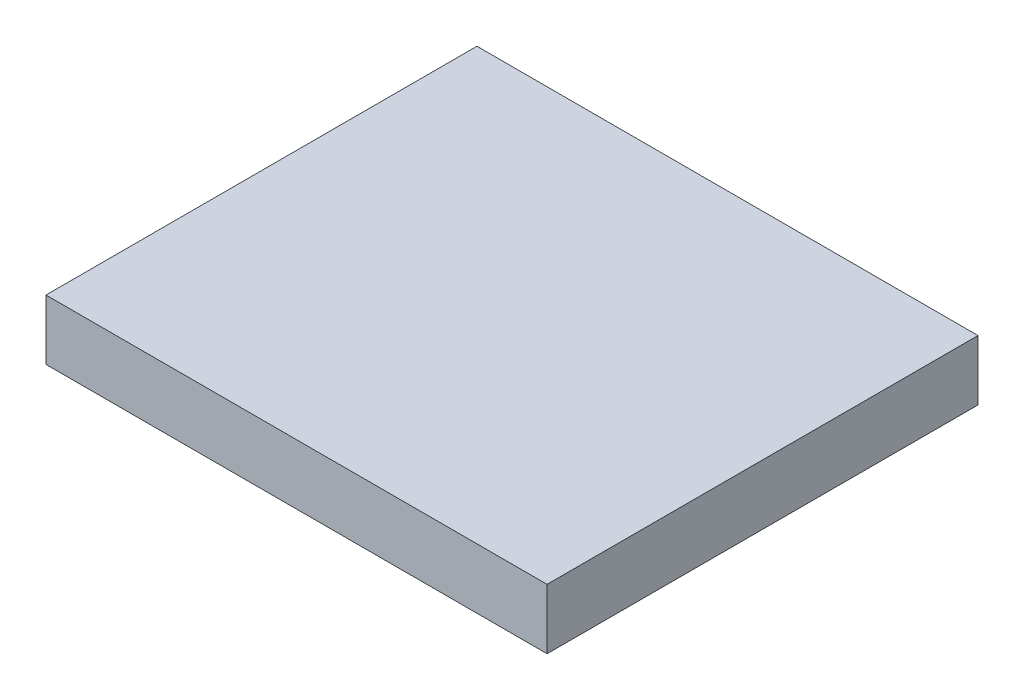
ISO-10303-21;
HEADER;
FILE_DESCRIPTION(('STEP AP214'),'2;1');
FILE_NAME('part.step','',(''),(''),'','','');
FILE_SCHEMA(('AUTOMOTIVE_DESIGN { 1 0 10303 214 1 1 1 1 }'));
ENDSEC;
DATA;
#1=APPLICATION_CONTEXT('core data for automotive mechanical design processes');
#2=APPLICATION_PROTOCOL_DEFINITION('international standard','automotive_design',2000,#1);
#3=PRODUCT_CONTEXT('',#1,'mechanical');
#4=PRODUCT('Part','Part','',(#3));
#5=PRODUCT_RELATED_PRODUCT_CATEGORY('part','',(#4));
#6=PRODUCT_DEFINITION_FORMATION('','',#4);
#7=PRODUCT_DEFINITION_CONTEXT('part definition',#1,'design');
#8=PRODUCT_DEFINITION('design','',#6,#7);
#9=PRODUCT_DEFINITION_SHAPE('','',#8);
#10=(LENGTH_UNIT() NAMED_UNIT(*) SI_UNIT(.MILLI.,.METRE.));
#11=(NAMED_UNIT(*) PLANE_ANGLE_UNIT() SI_UNIT($,.RADIAN.));
#12=(NAMED_UNIT(*) SI_UNIT($,.STERADIAN.) SOLID_ANGLE_UNIT());
#13=UNCERTAINTY_MEASURE_WITH_UNIT(LENGTH_MEASURE(1.E-05),#10,'distance_accuracy_value','');
#14=(GEOMETRIC_REPRESENTATION_CONTEXT(3) GLOBAL_UNCERTAINTY_ASSIGNED_CONTEXT((#13)) GLOBAL_UNIT_ASSIGNED_CONTEXT((#10,
#11,#12)) REPRESENTATION_CONTEXT('',''));
#15=CARTESIAN_POINT('',(0.,0.,0.));
#16=DIRECTION('',(0.,0.,1.));
#17=DIRECTION('',(1.,0.,0.));
#18=AXIS2_PLACEMENT_3D('',#15,#16,#17);
#19=CARTESIAN_POINT('',(25.,6.,-21.5));
#20=DIRECTION('',(-1.,0.,0.));
#21=DIRECTION('',(0.,0.,1.));
#22=AXIS2_PLACEMENT_3D('',#19,#20,#21);
#23=PLANE('',#22);
#24=DIRECTION('',(0.,0.,-1.));
#25=VECTOR('',#24,1.);
#26=CARTESIAN_POINT('',(25.,0.,-21.5));
#27=LINE('',#26,#25);
#28=CARTESIAN_POINT('',(25.,0.,21.5));
#29=VERTEX_POINT('',#28);
#30=CARTESIAN_POINT('',(25.,0.,-21.5));
#31=VERTEX_POINT('',#30);
#32=EDGE_CURVE('E96',#29,#31,#27,.T.);
#33=ORIENTED_EDGE('',*,*,#32,.T.);
#34=DIRECTION('',(0.,-1.,0.));
#35=VECTOR('',#34,1.);
#36=CARTESIAN_POINT('',(25.,6.,-21.5));
#37=LINE('',#36,#35);
#38=CARTESIAN_POINT('',(25.,6.,-21.5));
#39=VERTEX_POINT('',#38);
#40=EDGE_CURVE('E11',#39,#31,#37,.T.);
#41=ORIENTED_EDGE('',*,*,#40,.F.);
#42=DIRECTION('',(0.,0.,-1.));
#43=VECTOR('',#42,1.);
#44=CARTESIAN_POINT('',(25.,6.,-21.5));
#45=LINE('',#44,#43);
#46=CARTESIAN_POINT('',(25.,6.,21.5));
#47=VERTEX_POINT('',#46);
#48=EDGE_CURVE('E84',#47,#39,#45,.T.);
#49=ORIENTED_EDGE('',*,*,#48,.F.);
#50=DIRECTION('',(0.,-1.,0.));
#51=VECTOR('',#50,1.);
#52=CARTESIAN_POINT('',(25.,6.,21.5));
#53=LINE('',#52,#51);
#54=EDGE_CURVE('E92',#47,#29,#53,.T.);
#55=ORIENTED_EDGE('',*,*,#54,.T.);
#56=EDGE_LOOP('',(#33,#41,#49,#55));
#57=FACE_BOUND('',#56,.T.);
#58=ADVANCED_FACE('F33',(#57),#23,.F.);
#59=CARTESIAN_POINT('',(-25.,6.,-21.5));
#60=DIRECTION('',(0.,0.,1.));
#61=DIRECTION('',(1.,0.,0.));
#62=AXIS2_PLACEMENT_3D('',#59,#60,#61);
#63=PLANE('',#62);
#64=DIRECTION('',(-1.,0.,0.));
#65=VECTOR('',#64,1.);
#66=CARTESIAN_POINT('',(-25.,0.,-21.5));
#67=LINE('',#66,#65);
#68=CARTESIAN_POINT('',(-25.,0.,-21.5));
#69=VERTEX_POINT('',#68);
#70=EDGE_CURVE('E88',#31,#69,#67,.T.);
#71=ORIENTED_EDGE('',*,*,#70,.T.);
#72=DIRECTION('',(0.,-1.,0.));
#73=VECTOR('',#72,1.);
#74=CARTESIAN_POINT('',(-25.,6.,-21.5));
#75=LINE('',#74,#73);
#76=CARTESIAN_POINT('',(-25.,6.,-21.5));
#77=VERTEX_POINT('',#76);
#78=EDGE_CURVE('E41',#77,#69,#75,.T.);
#79=ORIENTED_EDGE('',*,*,#78,.F.);
#80=DIRECTION('',(-1.,0.,0.));
#81=VECTOR('',#80,1.);
#82=CARTESIAN_POINT('',(-25.,6.,-21.5));
#83=LINE('',#82,#81);
#84=EDGE_CURVE('E79',#39,#77,#83,.T.);
#85=ORIENTED_EDGE('',*,*,#84,.F.);
#86=ORIENTED_EDGE('',*,*,#40,.T.);
#87=EDGE_LOOP('',(#71,#79,#85,#86));
#88=FACE_BOUND('',#87,.T.);
#89=ADVANCED_FACE('F87',(#88),#63,.F.);
#90=CARTESIAN_POINT('',(-25.,6.,-21.5));
#91=DIRECTION('',(1.,0.,0.));
#92=DIRECTION('',(0.,0.,-1.));
#93=AXIS2_PLACEMENT_3D('',#90,#91,#92);
#94=PLANE('',#93);
#95=DIRECTION('',(0.,0.,1.));
#96=VECTOR('',#95,1.);
#97=CARTESIAN_POINT('',(-25.,0.,-21.5));
#98=LINE('',#97,#96);
#99=CARTESIAN_POINT('',(-25.,0.,21.5));
#100=VERTEX_POINT('',#99);
#101=EDGE_CURVE('E66',#69,#100,#98,.T.);
#102=ORIENTED_EDGE('',*,*,#101,.T.);
#103=DIRECTION('',(0.,-1.,0.));
#104=VECTOR('',#103,1.);
#105=CARTESIAN_POINT('',(-25.,6.,21.5));
#106=LINE('',#105,#104);
#107=CARTESIAN_POINT('',(-25.,6.,21.5));
#108=VERTEX_POINT('',#107);
#109=EDGE_CURVE('E89',#108,#100,#106,.T.);
#110=ORIENTED_EDGE('',*,*,#109,.F.);
#111=DIRECTION('',(0.,0.,1.));
#112=VECTOR('',#111,1.);
#113=CARTESIAN_POINT('',(-25.,6.,-21.5));
#114=LINE('',#113,#112);
#115=EDGE_CURVE('E82',#77,#108,#114,.T.);
#116=ORIENTED_EDGE('',*,*,#115,.F.);
#117=ORIENTED_EDGE('',*,*,#78,.T.);
#118=EDGE_LOOP('',(#102,#110,#116,#117));
#119=FACE_BOUND('',#118,.T.);
#120=ADVANCED_FACE('F90',(#119),#94,.F.);
#121=CARTESIAN_POINT('',(-25.,6.,21.5));
#122=DIRECTION('',(0.,0.,-1.));
#123=DIRECTION('',(-1.,0.,0.));
#124=AXIS2_PLACEMENT_3D('',#121,#122,#123);
#125=PLANE('',#124);
#126=DIRECTION('',(1.,0.,0.));
#127=VECTOR('',#126,1.);
#128=CARTESIAN_POINT('',(-25.,0.,21.5));
#129=LINE('',#128,#127);
#130=EDGE_CURVE('E72',#100,#29,#129,.T.);
#131=ORIENTED_EDGE('',*,*,#130,.T.);
#132=ORIENTED_EDGE('',*,*,#54,.F.);
#133=DIRECTION('',(1.,0.,0.));
#134=VECTOR('',#133,1.);
#135=CARTESIAN_POINT('',(-25.,6.,21.5));
#136=LINE('',#135,#134);
#137=EDGE_CURVE('E49',#108,#47,#136,.T.);
#138=ORIENTED_EDGE('',*,*,#137,.F.);
#139=ORIENTED_EDGE('',*,*,#109,.T.);
#140=EDGE_LOOP('',(#131,#132,#138,#139));
#141=FACE_BOUND('',#140,.T.);
#142=ADVANCED_FACE('F103',(#141),#125,.F.);
#143=CARTESIAN_POINT('',(0.,6.,0.));
#144=DIRECTION('',(0.,1.,0.));
#145=DIRECTION('',(0.,0.,1.));
#146=AXIS2_PLACEMENT_3D('',#143,#144,#145);
#147=PLANE('',#146);
#148=ORIENTED_EDGE('',*,*,#48,.T.);
#149=ORIENTED_EDGE('',*,*,#84,.T.);
#150=ORIENTED_EDGE('',*,*,#115,.T.);
#151=ORIENTED_EDGE('',*,*,#137,.T.);
#152=EDGE_LOOP('',(#148,#149,#150,#151));
#153=FACE_BOUND('',#152,.T.);
#154=ADVANCED_FACE('F80',(#153),#147,.T.);
#155=CARTESIAN_POINT('',(0.,0.,0.));
#156=DIRECTION('',(0.,1.,0.));
#157=DIRECTION('',(0.,0.,1.));
#158=AXIS2_PLACEMENT_3D('',#155,#156,#157);
#159=PLANE('',#158);
#160=ORIENTED_EDGE('',*,*,#32,.F.);
#161=ORIENTED_EDGE('',*,*,#130,.F.);
#162=ORIENTED_EDGE('',*,*,#101,.F.);
#163=ORIENTED_EDGE('',*,*,#70,.F.);
#164=EDGE_LOOP('',(#160,#161,#162,#163));
#165=FACE_BOUND('',#164,.T.);
#166=ADVANCED_FACE('F106',(#165),#159,.F.);
#167=CLOSED_SHELL('',(#58,#89,#120,#142,#154,#166));
#168=MANIFOLD_SOLID_BREP('B2',#167);
#169=ADVANCED_BREP_SHAPE_REPRESENTATION('',(#18,#168),#14);
#170=SHAPE_DEFINITION_REPRESENTATION(#9,#169);
ENDSEC;
END-ISO-10303-21;
